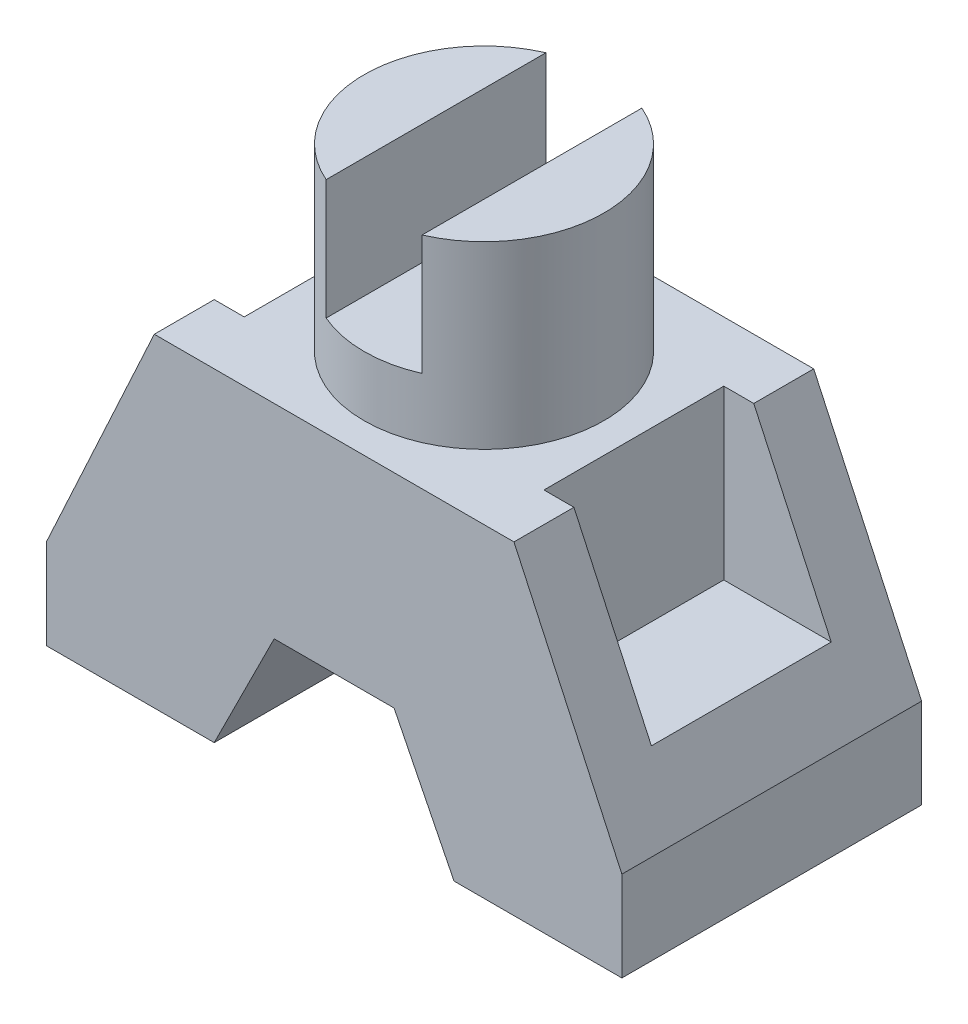
ISO-10303-21;
HEADER;
FILE_DESCRIPTION(('STEP AP214'),'2;1');
FILE_NAME('part.step','',(''),(''),'','','');
FILE_SCHEMA(('AUTOMOTIVE_DESIGN { 1 0 10303 214 1 1 1 1 }'));
ENDSEC;
DATA;
#1=APPLICATION_CONTEXT('core data for automotive mechanical design processes');
#2=APPLICATION_PROTOCOL_DEFINITION('international standard','automotive_design',2000,#1);
#3=PRODUCT_CONTEXT('',#1,'mechanical');
#4=PRODUCT('Part','Part','',(#3));
#5=PRODUCT_RELATED_PRODUCT_CATEGORY('part','',(#4));
#6=PRODUCT_DEFINITION_FORMATION('','',#4);
#7=PRODUCT_DEFINITION_CONTEXT('part definition',#1,'design');
#8=PRODUCT_DEFINITION('design','',#6,#7);
#9=PRODUCT_DEFINITION_SHAPE('','',#8);
#10=(LENGTH_UNIT() NAMED_UNIT(*) SI_UNIT(.MILLI.,.METRE.));
#11=(NAMED_UNIT(*) PLANE_ANGLE_UNIT() SI_UNIT($,.RADIAN.));
#12=(NAMED_UNIT(*) SI_UNIT($,.STERADIAN.) SOLID_ANGLE_UNIT());
#13=UNCERTAINTY_MEASURE_WITH_UNIT(LENGTH_MEASURE(1.E-05),#10,'distance_accuracy_value','');
#14=(GEOMETRIC_REPRESENTATION_CONTEXT(3) GLOBAL_UNCERTAINTY_ASSIGNED_CONTEXT((#13)) GLOBAL_UNIT_ASSIGNED_CONTEXT((#10,
#11,#12)) REPRESENTATION_CONTEXT('',''));
#15=CARTESIAN_POINT('',(0.,0.,0.));
#16=DIRECTION('',(0.,0.,1.));
#17=DIRECTION('',(1.,0.,0.));
#18=AXIS2_PLACEMENT_3D('',#15,#16,#17);
#19=CARTESIAN_POINT('',(0.,21.52297370401,50.));
#20=DIRECTION('',(0.,-1.,0.));
#21=DIRECTION('',(0.,0.,-1.));
#22=AXIS2_PLACEMENT_3D('',#19,#20,#21);
#23=PLANE('',#22);
#24=CARTESIAN_POINT('',(-15.4075275302662,21.52297370401,25.));
#25=DIRECTION('',(0.,1.,0.));
#26=DIRECTION('',(0.,0.,1.));
#27=AXIS2_PLACEMENT_3D('',#24,#25,#26);
#28=CIRCLE('',#27,20.);
#29=CARTESIAN_POINT('',(-15.4075275302662,21.52297370401,45.));
#30=VERTEX_POINT('',#29);
#31=EDGE_CURVE('E295',#30,#30,#28,.T.);
#32=ORIENTED_EDGE('',*,*,#31,.F.);
#33=EDGE_LOOP('',(#32));
#34=FACE_BOUND('',#33,.T.);
#35=DIRECTION('',(1.,0.,0.));
#36=VECTOR('',#35,1.);
#37=CARTESIAN_POINT('',(9.59247246973379,21.52297370401,40.));
#38=LINE('',#37,#36);
#39=CARTESIAN_POINT('',(9.59247246973379,21.52297370401,40.));
#40=VERTEX_POINT('',#39);
#41=CARTESIAN_POINT('',(14.5924724697338,21.52297370401,40.));
#42=VERTEX_POINT('',#41);
#43=EDGE_CURVE('E222',#40,#42,#38,.T.);
#44=ORIENTED_EDGE('',*,*,#43,.F.);
#45=DIRECTION('',(0.,0.,-1.));
#46=VECTOR('',#45,1.);
#47=CARTESIAN_POINT('',(9.59247246973379,21.52297370401,10.));
#48=LINE('',#47,#46);
#49=CARTESIAN_POINT('',(9.59247246973379,21.52297370401,10.));
#50=VERTEX_POINT('',#49);
#51=EDGE_CURVE('E197',#40,#50,#48,.T.);
#52=ORIENTED_EDGE('',*,*,#51,.T.);
#53=DIRECTION('',(1.,0.,0.));
#54=VECTOR('',#53,1.);
#55=CARTESIAN_POINT('',(9.59247246973379,21.52297370401,10.));
#56=LINE('',#55,#54);
#57=CARTESIAN_POINT('',(14.5924724697338,21.52297370401,10.));
#58=VERTEX_POINT('',#57);
#59=EDGE_CURVE('E191',#50,#58,#56,.T.);
#60=ORIENTED_EDGE('',*,*,#59,.T.);
#61=DIRECTION('',(0.,0.,-1.));
#62=VECTOR('',#61,1.);
#63=CARTESIAN_POINT('',(14.5924724697338,21.52297370401,50.));
#64=LINE('',#63,#62);
#65=CARTESIAN_POINT('',(14.5924724697338,21.52297370401,0.));
#66=VERTEX_POINT('',#65);
#67=EDGE_CURVE('E337',#58,#66,#64,.T.);
#68=ORIENTED_EDGE('',*,*,#67,.T.);
#69=DIRECTION('',(-1.,0.,0.));
#70=VECTOR('',#69,1.);
#71=CARTESIAN_POINT('',(0.,21.52297370401,0.));
#72=LINE('',#71,#70);
#73=CARTESIAN_POINT('',(-45.4075275302662,21.52297370401,0.));
#74=VERTEX_POINT('',#73);
#75=EDGE_CURVE('E294',#66,#74,#72,.T.);
#76=ORIENTED_EDGE('',*,*,#75,.T.);
#77=DIRECTION('',(0.,0.,-1.));
#78=VECTOR('',#77,1.);
#79=CARTESIAN_POINT('',(-45.4075275302662,21.52297370401,50.));
#80=LINE('',#79,#78);
#81=CARTESIAN_POINT('',(-45.4075275302662,21.52297370401,10.));
#82=VERTEX_POINT('',#81);
#83=EDGE_CURVE('E404',#82,#74,#80,.T.);
#84=ORIENTED_EDGE('',*,*,#83,.F.);
#85=DIRECTION('',(-1.,0.,0.));
#86=VECTOR('',#85,1.);
#87=CARTESIAN_POINT('',(-40.4075275302662,21.52297370401,10.));
#88=LINE('',#87,#86);
#89=CARTESIAN_POINT('',(-40.4075275302662,21.52297370401,10.));
#90=VERTEX_POINT('',#89);
#91=EDGE_CURVE('E246',#90,#82,#88,.T.);
#92=ORIENTED_EDGE('',*,*,#91,.F.);
#93=DIRECTION('',(0.,0.,-1.));
#94=VECTOR('',#93,1.);
#95=CARTESIAN_POINT('',(-40.4075275302662,21.52297370401,10.));
#96=LINE('',#95,#94);
#97=CARTESIAN_POINT('',(-40.4075275302662,21.52297370401,40.));
#98=VERTEX_POINT('',#97);
#99=EDGE_CURVE('E234',#98,#90,#96,.T.);
#100=ORIENTED_EDGE('',*,*,#99,.F.);
#101=DIRECTION('',(-1.,0.,0.));
#102=VECTOR('',#101,1.);
#103=CARTESIAN_POINT('',(-40.4075275302662,21.52297370401,40.));
#104=LINE('',#103,#102);
#105=CARTESIAN_POINT('',(-45.4075275302662,21.52297370401,40.));
#106=VERTEX_POINT('',#105);
#107=EDGE_CURVE('E249',#98,#106,#104,.T.);
#108=ORIENTED_EDGE('',*,*,#107,.T.);
#109=CARTESIAN_POINT('',(-45.4075275302662,21.52297370401,50.));
#110=VERTEX_POINT('',#109);
#111=EDGE_CURVE('E300',#110,#106,#80,.T.);
#112=ORIENTED_EDGE('',*,*,#111,.F.);
#113=DIRECTION('',(-1.,0.,0.));
#114=VECTOR('',#113,1.);
#115=CARTESIAN_POINT('',(0.,21.52297370401,50.));
#116=LINE('',#115,#114);
#117=CARTESIAN_POINT('',(14.5924724697338,21.52297370401,50.));
#118=VERTEX_POINT('',#117);
#119=EDGE_CURVE('E301',#118,#110,#116,.T.);
#120=ORIENTED_EDGE('',*,*,#119,.F.);
#121=EDGE_CURVE('E375',#118,#42,#64,.T.);
#122=ORIENTED_EDGE('',*,*,#121,.T.);
#123=EDGE_LOOP('',(#44,#52,#60,#68,#76,#84,#92,#100,#108,#112,#120,#122));
#124=FACE_BOUND('',#123,.T.);
#125=ADVANCED_FACE('F41',(#34,#124),#23,.F.);
#126=CARTESIAN_POINT('',(20.2191209575502,9.33190198040778,50.));
#127=DIRECTION('',(0.907959384500452,0.419058177461747,0.));
#128=DIRECTION('',(-0.419058177461747,0.907959384500452,0.));
#129=AXIS2_PLACEMENT_3D('',#126,#127,#128);
#130=PLANE('',#129);
#131=DIRECTION('',(0.,0.,1.));
#132=VECTOR('',#131,1.);
#133=CARTESIAN_POINT('',(27.5155493928107,-6.47702629599,50.));
#134=LINE('',#133,#132);
#135=CARTESIAN_POINT('',(27.5155493928107,-6.47702629599,10.));
#136=VERTEX_POINT('',#135);
#137=CARTESIAN_POINT('',(27.5155493928107,-6.47702629599001,40.));
#138=VERTEX_POINT('',#137);
#139=EDGE_CURVE('E49',#136,#138,#134,.T.);
#140=ORIENTED_EDGE('',*,*,#139,.T.);
#141=DIRECTION('',(-0.419058177461747,0.907959384500452,0.));
#142=VECTOR('',#141,1.);
#143=CARTESIAN_POINT('',(20.2191209575502,9.33190198040778,40.));
#144=LINE('',#143,#142);
#145=EDGE_CURVE('E11',#138,#42,#144,.T.);
#146=ORIENTED_EDGE('',*,*,#145,.T.);
#147=ORIENTED_EDGE('',*,*,#121,.F.);
#148=DIRECTION('',(0.419058177461747,-0.907959384500452,0.));
#149=VECTOR('',#148,1.);
#150=CARTESIAN_POINT('',(20.2191209575502,9.33190198040778,50.));
#151=LINE('',#150,#149);
#152=CARTESIAN_POINT('',(32.5924724697338,-17.47702629599,50.));
#153=VERTEX_POINT('',#152);
#154=EDGE_CURVE('E333',#118,#153,#151,.T.);
#155=ORIENTED_EDGE('',*,*,#154,.T.);
#156=DIRECTION('',(0.,0.,-1.));
#157=VECTOR('',#156,1.);
#158=CARTESIAN_POINT('',(32.5924724697338,-17.47702629599,50.));
#159=LINE('',#158,#157);
#160=CARTESIAN_POINT('',(32.5924724697338,-17.47702629599,0.));
#161=VERTEX_POINT('',#160);
#162=EDGE_CURVE('E379',#153,#161,#159,.T.);
#163=ORIENTED_EDGE('',*,*,#162,.T.);
#164=DIRECTION('',(0.419058177461747,-0.907959384500452,0.));
#165=VECTOR('',#164,1.);
#166=CARTESIAN_POINT('',(20.2191209575502,9.33190198040778,0.));
#167=LINE('',#166,#165);
#168=EDGE_CURVE('E306',#66,#161,#167,.T.);
#169=ORIENTED_EDGE('',*,*,#168,.F.);
#170=ORIENTED_EDGE('',*,*,#67,.F.);
#171=DIRECTION('',(0.419058177461747,-0.907959384500452,0.));
#172=VECTOR('',#171,1.);
#173=CARTESIAN_POINT('',(20.2191209575502,9.33190198040778,10.));
#174=LINE('',#173,#172);
#175=EDGE_CURVE('E419',#58,#136,#174,.T.);
#176=ORIENTED_EDGE('',*,*,#175,.T.);
#177=EDGE_LOOP('',(#140,#146,#147,#155,#163,#169,#170,#176));
#178=FACE_BOUND('',#177,.T.);
#179=ADVANCED_FACE('F423',(#178),#130,.T.);
#180=CARTESIAN_POINT('',(-15.4075275302662,51.52297370401,25.));
#181=DIRECTION('',(0.,1.,0.));
#182=DIRECTION('',(0.,0.,1.));
#183=AXIS2_PLACEMENT_3D('',#180,#181,#182);
#184=PLANE('',#183);
#185=DIRECTION('',(0.,0.,1.));
#186=VECTOR('',#185,1.);
#187=CARTESIAN_POINT('',(-23.4075275302662,51.52297370401,43.3303027798234));
#188=LINE('',#187,#186);
#189=CARTESIAN_POINT('',(-23.4075275302662,51.52297370401,6.66969722017663));
#190=VERTEX_POINT('',#189);
#191=CARTESIAN_POINT('',(-23.4075275302662,51.52297370401,43.3303027798234));
#192=VERTEX_POINT('',#191);
#193=EDGE_CURVE('E259',#190,#192,#188,.T.);
#194=ORIENTED_EDGE('',*,*,#193,.F.);
#195=CARTESIAN_POINT('',(-15.4075275302662,51.52297370401,25.));
#196=DIRECTION('',(0.,1.,0.));
#197=DIRECTION('',(0.,0.,1.));
#198=AXIS2_PLACEMENT_3D('',#195,#196,#197);
#199=CIRCLE('',#198,20.);
#200=EDGE_CURVE('E279',#190,#192,#199,.T.);
#201=ORIENTED_EDGE('',*,*,#200,.T.);
#202=EDGE_LOOP('',(#194,#201));
#203=FACE_BOUND('',#202,.T.);
#204=ADVANCED_FACE('F447',(#203),#184,.T.);
#205=CARTESIAN_POINT('',(-45.6227517147696,21.056654637586,50.));
#206=DIRECTION('',(0.907959384500452,-0.419058177461747,0.));
#207=DIRECTION('',(0.419058177461747,0.907959384500452,0.));
#208=AXIS2_PLACEMENT_3D('',#205,#206,#207);
#209=PLANE('',#208);
#210=DIRECTION('',(0.,0.,-1.));
#211=VECTOR('',#210,1.);
#212=CARTESIAN_POINT('',(-58.3306044533431,-6.47702629599,50.));
#213=LINE('',#212,#211);
#214=CARTESIAN_POINT('',(-58.3306044533431,-6.47702629599,40.));
#215=VERTEX_POINT('',#214);
#216=CARTESIAN_POINT('',(-58.3306044533431,-6.47702629599001,10.));
#217=VERTEX_POINT('',#216);
#218=EDGE_CURVE('E411',#215,#217,#213,.T.);
#219=ORIENTED_EDGE('',*,*,#218,.T.);
#220=DIRECTION('',(0.419058177461747,0.907959384500452,0.));
#221=VECTOR('',#220,1.);
#222=CARTESIAN_POINT('',(-45.6227517147696,21.056654637586,10.));
#223=LINE('',#222,#221);
#224=EDGE_CURVE('E415',#217,#82,#223,.T.);
#225=ORIENTED_EDGE('',*,*,#224,.T.);
#226=ORIENTED_EDGE('',*,*,#83,.T.);
#227=DIRECTION('',(-0.419058177461747,-0.907959384500452,0.));
#228=VECTOR('',#227,1.);
#229=CARTESIAN_POINT('',(-45.6227517147696,21.056654637586,0.));
#230=LINE('',#229,#228);
#231=CARTESIAN_POINT('',(-63.4075275302662,-17.47702629599,0.));
#232=VERTEX_POINT('',#231);
#233=EDGE_CURVE('E341',#74,#232,#230,.T.);
#234=ORIENTED_EDGE('',*,*,#233,.T.);
#235=DIRECTION('',(0.,0.,-1.));
#236=VECTOR('',#235,1.);
#237=CARTESIAN_POINT('',(-63.4075275302662,-17.47702629599,50.));
#238=LINE('',#237,#236);
#239=CARTESIAN_POINT('',(-63.4075275302662,-17.47702629599,50.));
#240=VERTEX_POINT('',#239);
#241=EDGE_CURVE('E401',#240,#232,#238,.T.);
#242=ORIENTED_EDGE('',*,*,#241,.F.);
#243=DIRECTION('',(-0.419058177461747,-0.907959384500452,0.));
#244=VECTOR('',#243,1.);
#245=CARTESIAN_POINT('',(-45.6227517147696,21.056654637586,50.));
#246=LINE('',#245,#244);
#247=EDGE_CURVE('E305',#110,#240,#246,.T.);
#248=ORIENTED_EDGE('',*,*,#247,.F.);
#249=ORIENTED_EDGE('',*,*,#111,.T.);
#250=DIRECTION('',(-0.419058177461747,-0.907959384500452,0.));
#251=VECTOR('',#250,1.);
#252=CARTESIAN_POINT('',(-45.6227517147696,21.056654637586,40.));
#253=LINE('',#252,#251);
#254=EDGE_CURVE('E299',#106,#215,#253,.T.);
#255=ORIENTED_EDGE('',*,*,#254,.T.);
#256=EDGE_LOOP('',(#219,#225,#226,#234,#242,#248,#249,#255));
#257=FACE_BOUND('',#256,.T.);
#258=ADVANCED_FACE('F499',(#257),#209,.F.);
#259=CARTESIAN_POINT('',(-63.4075275302662,0.,50.));
#260=DIRECTION('',(-1.,0.,0.));
#261=DIRECTION('',(0.,0.,1.));
#262=AXIS2_PLACEMENT_3D('',#259,#260,#261);
#263=PLANE('',#262);
#264=DIRECTION('',(0.,1.,0.));
#265=VECTOR('',#264,1.);
#266=CARTESIAN_POINT('',(-63.4075275302662,0.,0.));
#267=LINE('',#266,#265);
#268=CARTESIAN_POINT('',(-63.4075275302662,-32.47702629599,0.));
#269=VERTEX_POINT('',#268);
#270=EDGE_CURVE('E345',#269,#232,#267,.T.);
#271=ORIENTED_EDGE('',*,*,#270,.F.);
#272=DIRECTION('',(0.,0.,-1.));
#273=VECTOR('',#272,1.);
#274=CARTESIAN_POINT('',(-63.4075275302662,-32.47702629599,50.));
#275=LINE('',#274,#273);
#276=CARTESIAN_POINT('',(-63.4075275302662,-32.47702629599,50.));
#277=VERTEX_POINT('',#276);
#278=EDGE_CURVE('E398',#277,#269,#275,.T.);
#279=ORIENTED_EDGE('',*,*,#278,.F.);
#280=DIRECTION('',(0.,1.,0.));
#281=VECTOR('',#280,1.);
#282=CARTESIAN_POINT('',(-63.4075275302662,0.,50.));
#283=LINE('',#282,#281);
#284=EDGE_CURVE('E309',#277,#240,#283,.T.);
#285=ORIENTED_EDGE('',*,*,#284,.T.);
#286=ORIENTED_EDGE('',*,*,#241,.T.);
#287=EDGE_LOOP('',(#271,#279,#285,#286));
#288=FACE_BOUND('',#287,.T.);
#289=ADVANCED_FACE('F496',(#288),#263,.T.);
#290=CARTESIAN_POINT('',(0.,-32.47702629599,50.));
#291=DIRECTION('',(0.,1.,0.));
#292=DIRECTION('',(0.,0.,1.));
#293=AXIS2_PLACEMENT_3D('',#290,#291,#292);
#294=PLANE('',#293);
#295=DIRECTION('',(1.,0.,0.));
#296=VECTOR('',#295,1.);
#297=CARTESIAN_POINT('',(0.,-32.47702629599,0.));
#298=LINE('',#297,#296);
#299=CARTESIAN_POINT('',(-35.4075275302662,-32.47702629599,0.));
#300=VERTEX_POINT('',#299);
#301=EDGE_CURVE('E349',#269,#300,#298,.T.);
#302=ORIENTED_EDGE('',*,*,#301,.T.);
#303=DIRECTION('',(0.,0.,-1.));
#304=VECTOR('',#303,1.);
#305=CARTESIAN_POINT('',(-35.4075275302662,-32.47702629599,50.));
#306=LINE('',#305,#304);
#307=CARTESIAN_POINT('',(-35.4075275302662,-32.47702629599,50.));
#308=VERTEX_POINT('',#307);
#309=EDGE_CURVE('E395',#308,#300,#306,.T.);
#310=ORIENTED_EDGE('',*,*,#309,.F.);
#311=DIRECTION('',(1.,0.,0.));
#312=VECTOR('',#311,1.);
#313=CARTESIAN_POINT('',(0.,-32.47702629599,50.));
#314=LINE('',#313,#312);
#315=EDGE_CURVE('E313',#277,#308,#314,.T.);
#316=ORIENTED_EDGE('',*,*,#315,.F.);
#317=ORIENTED_EDGE('',*,*,#278,.T.);
#318=EDGE_LOOP('',(#302,#310,#316,#317));
#319=FACE_BOUND('',#318,.T.);
#320=ADVANCED_FACE('F492',(#319),#294,.F.);
#321=CARTESIAN_POINT('',(-15.335211505817,7.66760575290848,50.));
#322=DIRECTION('',(0.894427190999916,-0.447213595499958,0.));
#323=DIRECTION('',(0.447213595499958,0.894427190999916,0.));
#324=AXIS2_PLACEMENT_3D('',#321,#322,#323);
#325=PLANE('',#324);
#326=DIRECTION('',(-0.447213595499958,-0.894427190999916,0.));
#327=VECTOR('',#326,1.);
#328=CARTESIAN_POINT('',(-15.335211505817,7.66760575290848,0.));
#329=LINE('',#328,#327);
#330=CARTESIAN_POINT('',(-25.4075275302662,-12.47702629599,0.));
#331=VERTEX_POINT('',#330);
#332=EDGE_CURVE('E353',#331,#300,#329,.T.);
#333=ORIENTED_EDGE('',*,*,#332,.F.);
#334=DIRECTION('',(0.,0.,-1.));
#335=VECTOR('',#334,1.);
#336=CARTESIAN_POINT('',(-25.4075275302662,-12.47702629599,50.));
#337=LINE('',#336,#335);
#338=CARTESIAN_POINT('',(-25.4075275302662,-12.47702629599,50.));
#339=VERTEX_POINT('',#338);
#340=EDGE_CURVE('E392',#339,#331,#337,.T.);
#341=ORIENTED_EDGE('',*,*,#340,.F.);
#342=DIRECTION('',(-0.447213595499958,-0.894427190999916,0.));
#343=VECTOR('',#342,1.);
#344=CARTESIAN_POINT('',(-15.335211505817,7.66760575290848,50.));
#345=LINE('',#344,#343);
#346=EDGE_CURVE('E316',#339,#308,#345,.T.);
#347=ORIENTED_EDGE('',*,*,#346,.T.);
#348=ORIENTED_EDGE('',*,*,#309,.T.);
#349=EDGE_LOOP('',(#333,#341,#347,#348));
#350=FACE_BOUND('',#349,.T.);
#351=ADVANCED_FACE('F488',(#350),#325,.T.);
#352=CARTESIAN_POINT('',(0.,-12.47702629599,50.));
#353=DIRECTION('',(0.,1.,0.));
#354=DIRECTION('',(0.,0.,1.));
#355=AXIS2_PLACEMENT_3D('',#352,#353,#354);
#356=PLANE('',#355);
#357=DIRECTION('',(1.,0.,0.));
#358=VECTOR('',#357,1.);
#359=CARTESIAN_POINT('',(0.,-12.47702629599,0.));
#360=LINE('',#359,#358);
#361=CARTESIAN_POINT('',(-5.40752753026621,-12.47702629599,0.));
#362=VERTEX_POINT('',#361);
#363=EDGE_CURVE('E357',#331,#362,#360,.T.);
#364=ORIENTED_EDGE('',*,*,#363,.T.);
#365=DIRECTION('',(0.,0.,-1.));
#366=VECTOR('',#365,1.);
#367=CARTESIAN_POINT('',(-5.40752753026621,-12.47702629599,50.));
#368=LINE('',#367,#366);
#369=CARTESIAN_POINT('',(-5.40752753026621,-12.47702629599,50.));
#370=VERTEX_POINT('',#369);
#371=EDGE_CURVE('E389',#370,#362,#368,.T.);
#372=ORIENTED_EDGE('',*,*,#371,.F.);
#373=DIRECTION('',(1.,0.,0.));
#374=VECTOR('',#373,1.);
#375=CARTESIAN_POINT('',(0.,-12.47702629599,50.));
#376=LINE('',#375,#374);
#377=EDGE_CURVE('E320',#339,#370,#376,.T.);
#378=ORIENTED_EDGE('',*,*,#377,.F.);
#379=ORIENTED_EDGE('',*,*,#340,.T.);
#380=EDGE_LOOP('',(#364,#372,#378,#379));
#381=FACE_BOUND('',#380,.T.);
#382=ADVANCED_FACE('F484',(#381),#356,.F.);
#383=CARTESIAN_POINT('',(-9.31683254260897,-4.65841627130449,50.));
#384=DIRECTION('',(-0.894427190999916,-0.447213595499958,0.));
#385=DIRECTION('',(0.447213595499958,-0.894427190999916,0.));
#386=AXIS2_PLACEMENT_3D('',#383,#384,#385);
#387=PLANE('',#386);
#388=DIRECTION('',(-0.447213595499958,0.894427190999916,0.));
#389=VECTOR('',#388,1.);
#390=CARTESIAN_POINT('',(-9.31683254260897,-4.65841627130449,0.));
#391=LINE('',#390,#389);
#392=CARTESIAN_POINT('',(4.59247246973379,-32.47702629599,0.));
#393=VERTEX_POINT('',#392);
#394=EDGE_CURVE('E361',#393,#362,#391,.T.);
#395=ORIENTED_EDGE('',*,*,#394,.F.);
#396=DIRECTION('',(0.,0.,-1.));
#397=VECTOR('',#396,1.);
#398=CARTESIAN_POINT('',(4.59247246973379,-32.47702629599,50.));
#399=LINE('',#398,#397);
#400=CARTESIAN_POINT('',(4.59247246973379,-32.47702629599,50.));
#401=VERTEX_POINT('',#400);
#402=EDGE_CURVE('E386',#401,#393,#399,.T.);
#403=ORIENTED_EDGE('',*,*,#402,.F.);
#404=DIRECTION('',(-0.447213595499958,0.894427190999916,0.));
#405=VECTOR('',#404,1.);
#406=CARTESIAN_POINT('',(-9.31683254260897,-4.65841627130449,50.));
#407=LINE('',#406,#405);
#408=EDGE_CURVE('E323',#401,#370,#407,.T.);
#409=ORIENTED_EDGE('',*,*,#408,.T.);
#410=ORIENTED_EDGE('',*,*,#371,.T.);
#411=EDGE_LOOP('',(#395,#403,#409,#410));
#412=FACE_BOUND('',#411,.T.);
#413=ADVANCED_FACE('F480',(#412),#387,.T.);
#414=CARTESIAN_POINT('',(0.,-32.47702629599,50.));
#415=DIRECTION('',(0.,1.,0.));
#416=DIRECTION('',(0.,0.,1.));
#417=AXIS2_PLACEMENT_3D('',#414,#415,#416);
#418=PLANE('',#417);
#419=DIRECTION('',(1.,0.,0.));
#420=VECTOR('',#419,1.);
#421=CARTESIAN_POINT('',(0.,-32.47702629599,0.));
#422=LINE('',#421,#420);
#423=CARTESIAN_POINT('',(32.5924724697338,-32.47702629599,0.));
#424=VERTEX_POINT('',#423);
#425=EDGE_CURVE('E365',#393,#424,#422,.T.);
#426=ORIENTED_EDGE('',*,*,#425,.T.);
#427=DIRECTION('',(0.,0.,-1.));
#428=VECTOR('',#427,1.);
#429=CARTESIAN_POINT('',(32.5924724697338,-32.47702629599,50.));
#430=LINE('',#429,#428);
#431=CARTESIAN_POINT('',(32.5924724697338,-32.47702629599,50.));
#432=VERTEX_POINT('',#431);
#433=EDGE_CURVE('E382',#432,#424,#430,.T.);
#434=ORIENTED_EDGE('',*,*,#433,.F.);
#435=DIRECTION('',(1.,0.,0.));
#436=VECTOR('',#435,1.);
#437=CARTESIAN_POINT('',(0.,-32.47702629599,50.));
#438=LINE('',#437,#436);
#439=EDGE_CURVE('E327',#401,#432,#438,.T.);
#440=ORIENTED_EDGE('',*,*,#439,.F.);
#441=ORIENTED_EDGE('',*,*,#402,.T.);
#442=EDGE_LOOP('',(#426,#434,#440,#441));
#443=FACE_BOUND('',#442,.T.);
#444=ADVANCED_FACE('F476',(#443),#418,.F.);
#445=CARTESIAN_POINT('',(32.5924724697338,0.,50.));
#446=DIRECTION('',(-1.,0.,0.));
#447=DIRECTION('',(0.,0.,1.));
#448=AXIS2_PLACEMENT_3D('',#445,#446,#447);
#449=PLANE('',#448);
#450=DIRECTION('',(0.,1.,0.));
#451=VECTOR('',#450,1.);
#452=CARTESIAN_POINT('',(32.5924724697338,0.,0.));
#453=LINE('',#452,#451);
#454=EDGE_CURVE('E368',#424,#161,#453,.T.);
#455=ORIENTED_EDGE('',*,*,#454,.T.);
#456=ORIENTED_EDGE('',*,*,#162,.F.);
#457=DIRECTION('',(0.,1.,0.));
#458=VECTOR('',#457,1.);
#459=CARTESIAN_POINT('',(32.5924724697338,0.,50.));
#460=LINE('',#459,#458);
#461=EDGE_CURVE('E330',#432,#153,#460,.T.);
#462=ORIENTED_EDGE('',*,*,#461,.F.);
#463=ORIENTED_EDGE('',*,*,#433,.T.);
#464=EDGE_LOOP('',(#455,#456,#462,#463));
#465=FACE_BOUND('',#464,.T.);
#466=ADVANCED_FACE('F471',(#465),#449,.F.);
#467=CARTESIAN_POINT('',(0.,0.,50.));
#468=DIRECTION('',(0.,0.,1.));
#469=DIRECTION('',(1.,0.,0.));
#470=AXIS2_PLACEMENT_3D('',#467,#468,#469);
#471=PLANE('',#470);
#472=ORIENTED_EDGE('',*,*,#119,.T.);
#473=ORIENTED_EDGE('',*,*,#247,.T.);
#474=ORIENTED_EDGE('',*,*,#284,.F.);
#475=ORIENTED_EDGE('',*,*,#315,.T.);
#476=ORIENTED_EDGE('',*,*,#346,.F.);
#477=ORIENTED_EDGE('',*,*,#377,.T.);
#478=ORIENTED_EDGE('',*,*,#408,.F.);
#479=ORIENTED_EDGE('',*,*,#439,.T.);
#480=ORIENTED_EDGE('',*,*,#461,.T.);
#481=ORIENTED_EDGE('',*,*,#154,.F.);
#482=EDGE_LOOP('',(#472,#473,#474,#475,#476,#477,#478,#479,#480,#481));
#483=FACE_BOUND('',#482,.T.);
#484=ADVANCED_FACE('F464',(#483),#471,.T.);
#485=CARTESIAN_POINT('',(0.,0.,0.));
#486=DIRECTION('',(0.,0.,1.));
#487=DIRECTION('',(1.,0.,0.));
#488=AXIS2_PLACEMENT_3D('',#485,#486,#487);
#489=PLANE('',#488);
#490=ORIENTED_EDGE('',*,*,#75,.F.);
#491=ORIENTED_EDGE('',*,*,#168,.T.);
#492=ORIENTED_EDGE('',*,*,#454,.F.);
#493=ORIENTED_EDGE('',*,*,#425,.F.);
#494=ORIENTED_EDGE('',*,*,#394,.T.);
#495=ORIENTED_EDGE('',*,*,#363,.F.);
#496=ORIENTED_EDGE('',*,*,#332,.T.);
#497=ORIENTED_EDGE('',*,*,#301,.F.);
#498=ORIENTED_EDGE('',*,*,#270,.T.);
#499=ORIENTED_EDGE('',*,*,#233,.F.);
#500=EDGE_LOOP('',(#490,#491,#492,#493,#494,#495,#496,#497,#498,#499));
#501=FACE_BOUND('',#500,.T.);
#502=ADVANCED_FACE('F454',(#501),#489,.F.);
#503=CARTESIAN_POINT('',(-15.4075275302662,51.52297370401,25.));
#504=DIRECTION('',(0.,-1.,0.));
#505=DIRECTION('',(0.,0.,-1.));
#506=AXIS2_PLACEMENT_3D('',#503,#504,#505);
#507=CYLINDRICAL_SURFACE('',#506,20.);
#508=ORIENTED_EDGE('',*,*,#200,.F.);
#509=DIRECTION('',(0.,1.,0.));
#510=VECTOR('',#509,1.);
#511=CARTESIAN_POINT('',(-23.4075275302662,31.52297370401,6.66969722017663));
#512=LINE('',#511,#510);
#513=CARTESIAN_POINT('',(-23.4075275302662,31.52297370401,6.66969722017663));
#514=VERTEX_POINT('',#513);
#515=EDGE_CURVE('E284',#514,#190,#512,.T.);
#516=ORIENTED_EDGE('',*,*,#515,.F.);
#517=CARTESIAN_POINT('',(-15.4075275302662,31.52297370401,25.));
#518=DIRECTION('',(0.,1.,0.));
#519=DIRECTION('',(0.,0.,1.));
#520=AXIS2_PLACEMENT_3D('',#517,#518,#519);
#521=CIRCLE('',#520,20.);
#522=CARTESIAN_POINT('',(-7.40752753026621,31.52297370401,6.66969722017663));
#523=VERTEX_POINT('',#522);
#524=EDGE_CURVE('E258',#523,#514,#521,.T.);
#525=ORIENTED_EDGE('',*,*,#524,.F.);
#526=DIRECTION('',(0.,1.,0.));
#527=VECTOR('',#526,1.);
#528=CARTESIAN_POINT('',(-7.40752753026621,31.52297370401,6.66969722017663));
#529=LINE('',#528,#527);
#530=CARTESIAN_POINT('',(-7.40752753026621,51.52297370401,6.66969722017663));
#531=VERTEX_POINT('',#530);
#532=EDGE_CURVE('E271',#523,#531,#529,.T.);
#533=ORIENTED_EDGE('',*,*,#532,.T.);
#534=CARTESIAN_POINT('',(-7.40752753026621,51.52297370401,43.3303027798234));
#535=VERTEX_POINT('',#534);
#536=EDGE_CURVE('E290',#535,#531,#199,.T.);
#537=ORIENTED_EDGE('',*,*,#536,.F.);
#538=DIRECTION('',(0.,1.,0.));
#539=VECTOR('',#538,1.);
#540=CARTESIAN_POINT('',(-7.40752753026621,31.52297370401,43.3303027798234));
#541=LINE('',#540,#539);
#542=CARTESIAN_POINT('',(-7.40752753026621,31.52297370401,43.3303027798234));
#543=VERTEX_POINT('',#542);
#544=EDGE_CURVE('E276',#543,#535,#541,.T.);
#545=ORIENTED_EDGE('',*,*,#544,.F.);
#546=CARTESIAN_POINT('',(-15.4075275302662,31.52297370401,25.));
#547=DIRECTION('',(0.,1.,0.));
#548=DIRECTION('',(0.,0.,1.));
#549=AXIS2_PLACEMENT_3D('',#546,#547,#548);
#550=CIRCLE('',#549,20.);
#551=CARTESIAN_POINT('',(-23.4075275302662,31.52297370401,43.3303027798234));
#552=VERTEX_POINT('',#551);
#553=EDGE_CURVE('E267',#552,#543,#550,.T.);
#554=ORIENTED_EDGE('',*,*,#553,.F.);
#555=DIRECTION('',(0.,1.,0.));
#556=VECTOR('',#555,1.);
#557=CARTESIAN_POINT('',(-23.4075275302662,31.52297370401,43.3303027798234));
#558=LINE('',#557,#556);
#559=EDGE_CURVE('E280',#552,#192,#558,.T.);
#560=ORIENTED_EDGE('',*,*,#559,.T.);
#561=EDGE_LOOP('',(#508,#516,#525,#533,#537,#545,#554,#560));
#562=FACE_BOUND('',#561,.T.);
#563=ORIENTED_EDGE('',*,*,#31,.T.);
#564=EDGE_LOOP('',(#563));
#565=FACE_BOUND('',#564,.T.);
#566=ADVANCED_FACE('F451',(#562,#565),#507,.T.);
#567=DIRECTION('',(0.,0.,-1.));
#568=VECTOR('',#567,1.);
#569=CARTESIAN_POINT('',(-7.40752753026621,51.52297370401,25.));
#570=LINE('',#569,#568);
#571=EDGE_CURVE('E245',#535,#531,#570,.T.);
#572=ORIENTED_EDGE('',*,*,#571,.F.);
#573=ORIENTED_EDGE('',*,*,#536,.T.);
#574=EDGE_LOOP('',(#572,#573));
#575=FACE_BOUND('',#574,.T.);
#576=ADVANCED_FACE('F453',(#575),#184,.T.);
#577=CARTESIAN_POINT('',(-23.4075275302662,31.52297370401,43.3303027798234));
#578=DIRECTION('',(-1.,0.,0.));
#579=DIRECTION('',(0.,0.,1.));
#580=AXIS2_PLACEMENT_3D('',#577,#578,#579);
#581=PLANE('',#580);
#582=ORIENTED_EDGE('',*,*,#193,.T.);
#583=ORIENTED_EDGE('',*,*,#559,.F.);
#584=DIRECTION('',(0.,0.,1.));
#585=VECTOR('',#584,1.);
#586=CARTESIAN_POINT('',(-23.4075275302662,31.52297370401,43.3303027798234));
#587=LINE('',#586,#585);
#588=EDGE_CURVE('E263',#514,#552,#587,.T.);
#589=ORIENTED_EDGE('',*,*,#588,.F.);
#590=ORIENTED_EDGE('',*,*,#515,.T.);
#591=EDGE_LOOP('',(#582,#583,#589,#590));
#592=FACE_BOUND('',#591,.T.);
#593=ADVANCED_FACE('F461',(#592),#581,.F.);
#594=CARTESIAN_POINT('',(-7.40752753026621,31.52297370401,25.));
#595=DIRECTION('',(1.,0.,0.));
#596=DIRECTION('',(0.,0.,-1.));
#597=AXIS2_PLACEMENT_3D('',#594,#595,#596);
#598=PLANE('',#597);
#599=ORIENTED_EDGE('',*,*,#571,.T.);
#600=ORIENTED_EDGE('',*,*,#532,.F.);
#601=DIRECTION('',(0.,0.,-1.));
#602=VECTOR('',#601,1.);
#603=CARTESIAN_POINT('',(-7.40752753026621,31.52297370401,25.));
#604=LINE('',#603,#602);
#605=EDGE_CURVE('E255',#543,#523,#604,.T.);
#606=ORIENTED_EDGE('',*,*,#605,.F.);
#607=ORIENTED_EDGE('',*,*,#544,.T.);
#608=EDGE_LOOP('',(#599,#600,#606,#607));
#609=FACE_BOUND('',#608,.T.);
#610=ADVANCED_FACE('F533',(#609),#598,.F.);
#611=CARTESIAN_POINT('',(-15.4075275302662,31.52297370401,25.));
#612=DIRECTION('',(0.,1.,0.));
#613=DIRECTION('',(0.,0.,1.));
#614=AXIS2_PLACEMENT_3D('',#611,#612,#613);
#615=PLANE('',#614);
#616=ORIENTED_EDGE('',*,*,#605,.T.);
#617=ORIENTED_EDGE('',*,*,#524,.T.);
#618=ORIENTED_EDGE('',*,*,#588,.T.);
#619=ORIENTED_EDGE('',*,*,#553,.T.);
#620=EDGE_LOOP('',(#616,#617,#618,#619));
#621=FACE_BOUND('',#620,.T.);
#622=ADVANCED_FACE('F528',(#621),#615,.T.);
#623=CARTESIAN_POINT('',(-40.4075275302662,-6.47702629599,10.));
#624=DIRECTION('',(0.,-1.,0.));
#625=DIRECTION('',(0.,0.,-1.));
#626=AXIS2_PLACEMENT_3D('',#623,#624,#625);
#627=PLANE('',#626);
#628=DIRECTION('',(-1.,0.,0.));
#629=VECTOR('',#628,1.);
#630=CARTESIAN_POINT('',(-40.4075275302662,-6.47702629599,40.));
#631=LINE('',#630,#629);
#632=CARTESIAN_POINT('',(-40.4075275302662,-6.47702629599,40.));
#633=VERTEX_POINT('',#632);
#634=EDGE_CURVE('E64',#633,#215,#631,.T.);
#635=ORIENTED_EDGE('',*,*,#634,.F.);
#636=DIRECTION('',(0.,0.,1.));
#637=VECTOR('',#636,1.);
#638=CARTESIAN_POINT('',(-40.4075275302662,-6.47702629599,10.));
#639=LINE('',#638,#637);
#640=CARTESIAN_POINT('',(-40.4075275302662,-6.47702629599,10.));
#641=VERTEX_POINT('',#640);
#642=EDGE_CURVE('E221',#641,#633,#639,.T.);
#643=ORIENTED_EDGE('',*,*,#642,.F.);
#644=DIRECTION('',(-1.,0.,0.));
#645=VECTOR('',#644,1.);
#646=CARTESIAN_POINT('',(-40.4075275302662,-6.47702629599,10.));
#647=LINE('',#646,#645);
#648=EDGE_CURVE('E241',#641,#217,#647,.T.);
#649=ORIENTED_EDGE('',*,*,#648,.T.);
#650=ORIENTED_EDGE('',*,*,#218,.F.);
#651=EDGE_LOOP('',(#635,#643,#649,#650));
#652=FACE_BOUND('',#651,.T.);
#653=ADVANCED_FACE('F509',(#652),#627,.F.);
#654=CARTESIAN_POINT('',(-40.4075275302662,21.52297370401,10.));
#655=DIRECTION('',(0.,0.,-1.));
#656=DIRECTION('',(-1.,0.,0.));
#657=AXIS2_PLACEMENT_3D('',#654,#655,#656);
#658=PLANE('',#657);
#659=ORIENTED_EDGE('',*,*,#648,.F.);
#660=DIRECTION('',(0.,-1.,0.));
#661=VECTOR('',#660,1.);
#662=CARTESIAN_POINT('',(-40.4075275302662,21.52297370401,10.));
#663=LINE('',#662,#661);
#664=EDGE_CURVE('E237',#90,#641,#663,.T.);
#665=ORIENTED_EDGE('',*,*,#664,.F.);
#666=ORIENTED_EDGE('',*,*,#91,.T.);
#667=ORIENTED_EDGE('',*,*,#224,.F.);
#668=EDGE_LOOP('',(#659,#665,#666,#667));
#669=FACE_BOUND('',#668,.T.);
#670=ADVANCED_FACE('F513',(#669),#658,.F.);
#671=CARTESIAN_POINT('',(-40.4075275302662,-6.47702629599,40.));
#672=DIRECTION('',(0.,0.,1.));
#673=DIRECTION('',(1.,0.,0.));
#674=AXIS2_PLACEMENT_3D('',#671,#672,#673);
#675=PLANE('',#674);
#676=ORIENTED_EDGE('',*,*,#107,.F.);
#677=DIRECTION('',(0.,1.,0.));
#678=VECTOR('',#677,1.);
#679=CARTESIAN_POINT('',(-40.4075275302662,-6.47702629599,40.));
#680=LINE('',#679,#678);
#681=EDGE_CURVE('E230',#633,#98,#680,.T.);
#682=ORIENTED_EDGE('',*,*,#681,.F.);
#683=ORIENTED_EDGE('',*,*,#634,.T.);
#684=ORIENTED_EDGE('',*,*,#254,.F.);
#685=EDGE_LOOP('',(#676,#682,#683,#684));
#686=FACE_BOUND('',#685,.T.);
#687=ADVANCED_FACE('F544',(#686),#675,.F.);
#688=CARTESIAN_POINT('',(-40.4075275302662,0.,0.));
#689=DIRECTION('',(-1.,0.,0.));
#690=DIRECTION('',(0.,0.,1.));
#691=AXIS2_PLACEMENT_3D('',#688,#689,#690);
#692=PLANE('',#691);
#693=ORIENTED_EDGE('',*,*,#642,.T.);
#694=ORIENTED_EDGE('',*,*,#681,.T.);
#695=ORIENTED_EDGE('',*,*,#99,.T.);
#696=ORIENTED_EDGE('',*,*,#664,.T.);
#697=EDGE_LOOP('',(#693,#694,#695,#696));
#698=FACE_BOUND('',#697,.T.);
#699=ADVANCED_FACE('F439',(#698),#692,.T.);
#700=CARTESIAN_POINT('',(9.59247246973379,-6.47702629599,10.));
#701=DIRECTION('',(0.,1.,0.));
#702=DIRECTION('',(0.,0.,1.));
#703=AXIS2_PLACEMENT_3D('',#700,#701,#702);
#704=PLANE('',#703);
#705=DIRECTION('',(1.,0.,0.));
#706=VECTOR('',#705,1.);
#707=CARTESIAN_POINT('',(9.59247246973379,-6.47702629599,10.));
#708=LINE('',#707,#706);
#709=CARTESIAN_POINT('',(9.59247246973379,-6.47702629599,10.));
#710=VERTEX_POINT('',#709);
#711=EDGE_CURVE('E56',#710,#136,#708,.T.);
#712=ORIENTED_EDGE('',*,*,#711,.F.);
#713=DIRECTION('',(0.,0.,1.));
#714=VECTOR('',#713,1.);
#715=CARTESIAN_POINT('',(9.59247246973379,-6.47702629599,10.));
#716=LINE('',#715,#714);
#717=CARTESIAN_POINT('',(9.59247246973379,-6.47702629599,40.));
#718=VERTEX_POINT('',#717);
#719=EDGE_CURVE('E198',#710,#718,#716,.T.);
#720=ORIENTED_EDGE('',*,*,#719,.T.);
#721=DIRECTION('',(1.,0.,0.));
#722=VECTOR('',#721,1.);
#723=CARTESIAN_POINT('',(9.59247246973379,-6.47702629599,40.));
#724=LINE('',#723,#722);
#725=EDGE_CURVE('E218',#718,#138,#724,.T.);
#726=ORIENTED_EDGE('',*,*,#725,.T.);
#727=ORIENTED_EDGE('',*,*,#139,.F.);
#728=EDGE_LOOP('',(#712,#720,#726,#727));
#729=FACE_BOUND('',#728,.T.);
#730=ADVANCED_FACE('F202',(#729),#704,.T.);
#731=CARTESIAN_POINT('',(9.59247246973379,-6.47702629599,40.));
#732=DIRECTION('',(0.,0.,-1.));
#733=DIRECTION('',(-1.,0.,0.));
#734=AXIS2_PLACEMENT_3D('',#731,#732,#733);
#735=PLANE('',#734);
#736=ORIENTED_EDGE('',*,*,#725,.F.);
#737=DIRECTION('',(0.,1.,0.));
#738=VECTOR('',#737,1.);
#739=CARTESIAN_POINT('',(9.59247246973379,-6.47702629599,40.));
#740=LINE('',#739,#738);
#741=EDGE_CURVE('E208',#718,#40,#740,.T.);
#742=ORIENTED_EDGE('',*,*,#741,.T.);
#743=ORIENTED_EDGE('',*,*,#43,.T.);
#744=ORIENTED_EDGE('',*,*,#145,.F.);
#745=EDGE_LOOP('',(#736,#742,#743,#744));
#746=FACE_BOUND('',#745,.T.);
#747=ADVANCED_FACE('F431',(#746),#735,.T.);
#748=CARTESIAN_POINT('',(9.59247246973379,21.52297370401,10.));
#749=DIRECTION('',(0.,0.,1.));
#750=DIRECTION('',(1.,0.,0.));
#751=AXIS2_PLACEMENT_3D('',#748,#749,#750);
#752=PLANE('',#751);
#753=ORIENTED_EDGE('',*,*,#59,.F.);
#754=DIRECTION('',(0.,-1.,0.));
#755=VECTOR('',#754,1.);
#756=CARTESIAN_POINT('',(9.59247246973379,21.52297370401,10.));
#757=LINE('',#756,#755);
#758=EDGE_CURVE('E188',#50,#710,#757,.T.);
#759=ORIENTED_EDGE('',*,*,#758,.T.);
#760=ORIENTED_EDGE('',*,*,#711,.T.);
#761=ORIENTED_EDGE('',*,*,#175,.F.);
#762=EDGE_LOOP('',(#753,#759,#760,#761));
#763=FACE_BOUND('',#762,.T.);
#764=ADVANCED_FACE('F189',(#763),#752,.T.);
#765=CARTESIAN_POINT('',(9.59247246973379,0.,0.));
#766=DIRECTION('',(1.,0.,0.));
#767=DIRECTION('',(0.,0.,1.));
#768=AXIS2_PLACEMENT_3D('',#765,#766,#767);
#769=PLANE('',#768);
#770=ORIENTED_EDGE('',*,*,#719,.F.);
#771=ORIENTED_EDGE('',*,*,#758,.F.);
#772=ORIENTED_EDGE('',*,*,#51,.F.);
#773=ORIENTED_EDGE('',*,*,#741,.F.);
#774=EDGE_LOOP('',(#770,#771,#772,#773));
#775=FACE_BOUND('',#774,.T.);
#776=ADVANCED_FACE('F210',(#775),#769,.T.);
#777=CLOSED_SHELL('',(#125,#179,#204,#258,#289,#320,#351,#382,#413,#444,#466,#484,#502,#566,
#576,#593,#610,#622,#653,#670,#687,#699,#730,#747,#764,#776));
#778=MANIFOLD_SOLID_BREP('B2',#777);
#779=ADVANCED_BREP_SHAPE_REPRESENTATION('',(#18,#778),#14);
#780=SHAPE_DEFINITION_REPRESENTATION(#9,#779);
ENDSEC;
END-ISO-10303-21;
